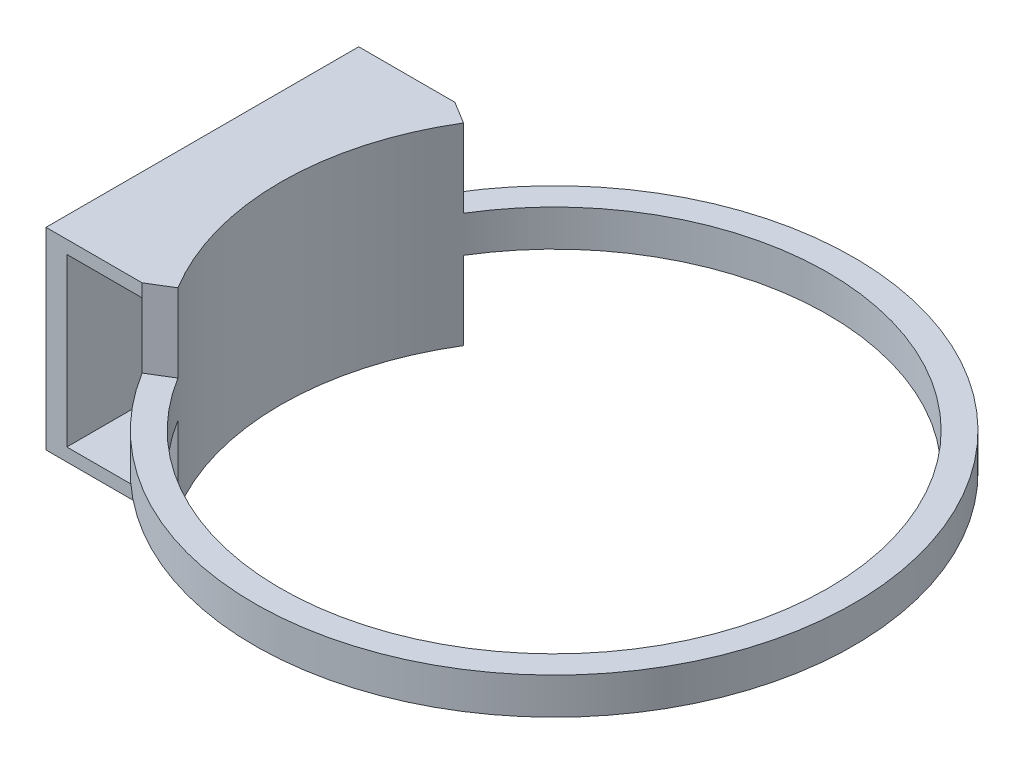
ISO-10303-21;
HEADER;
FILE_DESCRIPTION(('STEP AP214'),'2;1');
FILE_NAME('part.step','',(''),(''),'','','');
FILE_SCHEMA(('AUTOMOTIVE_DESIGN { 1 0 10303 214 1 1 1 1 }'));
ENDSEC;
DATA;
#1=APPLICATION_CONTEXT('core data for automotive mechanical design processes');
#2=APPLICATION_PROTOCOL_DEFINITION('international standard','automotive_design',2000,#1);
#3=PRODUCT_CONTEXT('',#1,'mechanical');
#4=PRODUCT('Part','Part','',(#3));
#5=PRODUCT_RELATED_PRODUCT_CATEGORY('part','',(#4));
#6=PRODUCT_DEFINITION_FORMATION('','',#4);
#7=PRODUCT_DEFINITION_CONTEXT('part definition',#1,'design');
#8=PRODUCT_DEFINITION('design','',#6,#7);
#9=PRODUCT_DEFINITION_SHAPE('','',#8);
#10=(LENGTH_UNIT() NAMED_UNIT(*) SI_UNIT(.MILLI.,.METRE.));
#11=(NAMED_UNIT(*) PLANE_ANGLE_UNIT() SI_UNIT($,.RADIAN.));
#12=(NAMED_UNIT(*) SI_UNIT($,.STERADIAN.) SOLID_ANGLE_UNIT());
#13=UNCERTAINTY_MEASURE_WITH_UNIT(LENGTH_MEASURE(1.E-05),#10,'distance_accuracy_value','');
#14=(GEOMETRIC_REPRESENTATION_CONTEXT(3) GLOBAL_UNCERTAINTY_ASSIGNED_CONTEXT((#13)) GLOBAL_UNIT_ASSIGNED_CONTEXT((#10,
#11,#12)) REPRESENTATION_CONTEXT('',''));
#15=CARTESIAN_POINT('',(0.,0.,0.));
#16=DIRECTION('',(0.,0.,1.));
#17=DIRECTION('',(1.,0.,0.));
#18=AXIS2_PLACEMENT_3D('',#15,#16,#17);
#19=CARTESIAN_POINT('',(0.,0.5,0.));
#20=DIRECTION('',(0.,-1.,0.));
#21=DIRECTION('',(0.,0.,-1.));
#22=AXIS2_PLACEMENT_3D('',#19,#20,#21);
#23=CYLINDRICAL_SURFACE('',#22,11.5);
#24=CARTESIAN_POINT('',(0.,3.,0.));
#25=DIRECTION('',(0.,-1.,0.));
#26=DIRECTION('',(0.,0.,-1.));
#27=AXIS2_PLACEMENT_3D('',#24,#25,#26);
#28=CIRCLE('',#27,11.5);
#29=CARTESIAN_POINT('',(-9.81070843517429,3.,-6.));
#30=VERTEX_POINT('',#29);
#31=CARTESIAN_POINT('',(-9.8107084351743,3.,5.99999999999999));
#32=VERTEX_POINT('',#31);
#33=EDGE_CURVE('E154',#30,#32,#28,.T.);
#34=ORIENTED_EDGE('',*,*,#33,.F.);
#35=DIRECTION('',(0.,-1.,0.));
#36=VECTOR('',#35,1.);
#37=CARTESIAN_POINT('',(-9.81070843517429,3.,-6.));
#38=LINE('',#37,#36);
#39=CARTESIAN_POINT('',(-9.81070843517429,0.5,-6.));
#40=VERTEX_POINT('',#39);
#41=EDGE_CURVE('E196',#30,#40,#38,.T.);
#42=ORIENTED_EDGE('',*,*,#41,.T.);
#43=CARTESIAN_POINT('',(0.,0.5,0.));
#44=DIRECTION('',(0.,1.,0.));
#45=DIRECTION('',(0.,0.,1.));
#46=AXIS2_PLACEMENT_3D('',#43,#44,#45);
#47=CIRCLE('',#46,11.5);
#48=CARTESIAN_POINT('',(-9.8107084351743,0.5,5.99999999999999));
#49=VERTEX_POINT('',#48);
#50=EDGE_CURVE('E11',#40,#49,#47,.T.);
#51=ORIENTED_EDGE('',*,*,#50,.T.);
#52=DIRECTION('',(0.,-1.,0.));
#53=VECTOR('',#52,1.);
#54=CARTESIAN_POINT('',(-9.8107084351743,3.,5.99999999999999));
#55=LINE('',#54,#53);
#56=EDGE_CURVE('E147',#32,#49,#55,.T.);
#57=ORIENTED_EDGE('',*,*,#56,.F.);
#58=EDGE_LOOP('',(#34,#42,#51,#57));
#59=FACE_BOUND('',#58,.T.);
#60=CARTESIAN_POINT('',(0.,4.4,0.));
#61=DIRECTION('',(0.,1.,0.));
#62=DIRECTION('',(0.,0.,1.));
#63=AXIS2_PLACEMENT_3D('',#60,#61,#62);
#64=CIRCLE('',#63,11.5);
#65=CARTESIAN_POINT('',(-9.8107084351743,4.4,6.));
#66=VERTEX_POINT('',#65);
#67=CARTESIAN_POINT('',(-9.81070843517429,4.4,-6.));
#68=VERTEX_POINT('',#67);
#69=EDGE_CURVE('E176',#66,#68,#64,.T.);
#70=ORIENTED_EDGE('',*,*,#69,.F.);
#71=DIRECTION('',(0.,1.,0.));
#72=VECTOR('',#71,1.);
#73=CARTESIAN_POINT('',(-9.8107084351743,4.4,6.));
#74=LINE('',#73,#72);
#75=CARTESIAN_POINT('',(-9.8107084351743,6.9,6.));
#76=VERTEX_POINT('',#75);
#77=EDGE_CURVE('E199',#66,#76,#74,.T.);
#78=ORIENTED_EDGE('',*,*,#77,.T.);
#79=CARTESIAN_POINT('',(1.16226472890446E-13,6.9,0.));
#80=DIRECTION('',(0.,-1.,0.));
#81=DIRECTION('',(0.,0.,-1.));
#82=AXIS2_PLACEMENT_3D('',#79,#80,#81);
#83=CIRCLE('',#82,11.5000000000001);
#84=CARTESIAN_POINT('',(-9.81070843517429,6.9,-6.));
#85=VERTEX_POINT('',#84);
#86=EDGE_CURVE('E230',#76,#85,#83,.T.);
#87=ORIENTED_EDGE('',*,*,#86,.T.);
#88=DIRECTION('',(0.,1.,0.));
#89=VECTOR('',#88,1.);
#90=CARTESIAN_POINT('',(-9.81070843517429,4.4,-6.));
#91=LINE('',#90,#89);
#92=EDGE_CURVE('E192',#68,#85,#91,.T.);
#93=ORIENTED_EDGE('',*,*,#92,.F.);
#94=EDGE_LOOP('',(#70,#78,#87,#93));
#95=FACE_BOUND('',#94,.T.);
#96=ADVANCED_FACE('F41',(#59,#95),#23,.T.);
#97=CARTESIAN_POINT('',(0.,0.5,0.));
#98=DIRECTION('',(0.,1.,0.));
#99=DIRECTION('',(0.,0.,1.));
#100=AXIS2_PLACEMENT_3D('',#97,#98,#99);
#101=PLANE('',#100);
#102=DIRECTION('',(-1.,0.,0.));
#103=VECTOR('',#102,1.);
#104=CARTESIAN_POINT('',(-13.5,0.5,-6.));
#105=LINE('',#104,#103);
#106=CARTESIAN_POINT('',(-12.7,0.5,-6.));
#107=VERTEX_POINT('',#106);
#108=EDGE_CURVE('E63',#40,#107,#105,.T.);
#109=ORIENTED_EDGE('',*,*,#108,.T.);
#110=DIRECTION('',(0.,0.,-1.));
#111=VECTOR('',#110,1.);
#112=CARTESIAN_POINT('',(-12.7,0.5,-6.));
#113=LINE('',#112,#111);
#114=CARTESIAN_POINT('',(-12.7,0.5,6.));
#115=VERTEX_POINT('',#114);
#116=EDGE_CURVE('E58',#115,#107,#113,.T.);
#117=ORIENTED_EDGE('',*,*,#116,.F.);
#118=DIRECTION('',(1.,0.,0.));
#119=VECTOR('',#118,1.);
#120=CARTESIAN_POINT('',(-13.5,0.5,6.));
#121=LINE('',#120,#119);
#122=EDGE_CURVE('E264',#115,#49,#121,.T.);
#123=ORIENTED_EDGE('',*,*,#122,.T.);
#124=ORIENTED_EDGE('',*,*,#50,.F.);
#125=EDGE_LOOP('',(#109,#117,#123,#124));
#126=FACE_BOUND('',#125,.T.);
#127=ADVANCED_FACE('F337',(#126),#101,.T.);
#128=CARTESIAN_POINT('',(-13.5,0.5,-6.));
#129=DIRECTION('',(0.,0.,1.));
#130=DIRECTION('',(1.,0.,0.));
#131=AXIS2_PLACEMENT_3D('',#128,#129,#130);
#132=PLANE('',#131);
#133=DIRECTION('',(-1.,0.,0.));
#134=VECTOR('',#133,1.);
#135=CARTESIAN_POINT('',(-13.5,0.,-6.));
#136=LINE('',#135,#134);
#137=CARTESIAN_POINT('',(-9.81070843517429,0.,-6.));
#138=VERTEX_POINT('',#137);
#139=CARTESIAN_POINT('',(-13.5,0.,-6.));
#140=VERTEX_POINT('',#139);
#141=EDGE_CURVE('E260',#138,#140,#136,.T.);
#142=ORIENTED_EDGE('',*,*,#141,.T.);
#143=DIRECTION('',(0.,-1.,0.));
#144=VECTOR('',#143,1.);
#145=CARTESIAN_POINT('',(-13.5,0.5,-6.));
#146=LINE('',#145,#144);
#147=CARTESIAN_POINT('',(-13.5,7.4,-6.));
#148=VERTEX_POINT('',#147);
#149=EDGE_CURVE('E287',#148,#140,#146,.T.);
#150=ORIENTED_EDGE('',*,*,#149,.F.);
#151=DIRECTION('',(-1.,0.,0.));
#152=VECTOR('',#151,1.);
#153=CARTESIAN_POINT('',(-13.5,7.4,-6.));
#154=LINE('',#153,#152);
#155=CARTESIAN_POINT('',(-9.81070843517429,7.4,-6.));
#156=VERTEX_POINT('',#155);
#157=EDGE_CURVE('E222',#156,#148,#154,.T.);
#158=ORIENTED_EDGE('',*,*,#157,.F.);
#159=DIRECTION('',(0.,-1.,0.));
#160=VECTOR('',#159,1.);
#161=CARTESIAN_POINT('',(-9.81070843517429,7.4,-6.));
#162=LINE('',#161,#160);
#163=EDGE_CURVE('E226',#156,#85,#162,.T.);
#164=ORIENTED_EDGE('',*,*,#163,.T.);
#165=DIRECTION('',(-1.,0.,0.));
#166=VECTOR('',#165,1.);
#167=CARTESIAN_POINT('',(-13.5,6.9,-6.));
#168=LINE('',#167,#166);
#169=CARTESIAN_POINT('',(-12.7,6.9,-6.));
#170=VERTEX_POINT('',#169);
#171=EDGE_CURVE('E218',#85,#170,#168,.T.);
#172=ORIENTED_EDGE('',*,*,#171,.T.);
#173=DIRECTION('',(0.,-1.,0.));
#174=VECTOR('',#173,1.);
#175=CARTESIAN_POINT('',(-12.7,6.9,-6.));
#176=LINE('',#175,#174);
#177=EDGE_CURVE('E247',#170,#107,#176,.T.);
#178=ORIENTED_EDGE('',*,*,#177,.T.);
#179=ORIENTED_EDGE('',*,*,#108,.F.);
#180=DIRECTION('',(0.,-1.,0.));
#181=VECTOR('',#180,1.);
#182=CARTESIAN_POINT('',(-9.81070843517429,0.5,-6.));
#183=LINE('',#182,#181);
#184=EDGE_CURVE('E45',#40,#138,#183,.T.);
#185=ORIENTED_EDGE('',*,*,#184,.T.);
#186=EDGE_LOOP('',(#142,#150,#158,#164,#172,#178,#179,#185));
#187=FACE_BOUND('',#186,.T.);
#188=ADVANCED_FACE('F43',(#187),#132,.F.);
#189=CARTESIAN_POINT('',(-13.5,0.5,0.));
#190=DIRECTION('',(1.,0.,0.));
#191=DIRECTION('',(0.,0.,-1.));
#192=AXIS2_PLACEMENT_3D('',#189,#190,#191);
#193=PLANE('',#192);
#194=DIRECTION('',(0.,0.,1.));
#195=VECTOR('',#194,1.);
#196=CARTESIAN_POINT('',(-13.5,0.,0.));
#197=LINE('',#196,#195);
#198=CARTESIAN_POINT('',(-13.5,0.,6.));
#199=VERTEX_POINT('',#198);
#200=EDGE_CURVE('E272',#140,#199,#197,.T.);
#201=ORIENTED_EDGE('',*,*,#200,.T.);
#202=DIRECTION('',(0.,-1.,0.));
#203=VECTOR('',#202,1.);
#204=CARTESIAN_POINT('',(-13.5,0.5,6.));
#205=LINE('',#204,#203);
#206=CARTESIAN_POINT('',(-13.5,7.4,6.));
#207=VERTEX_POINT('',#206);
#208=EDGE_CURVE('E284',#207,#199,#205,.T.);
#209=ORIENTED_EDGE('',*,*,#208,.F.);
#210=DIRECTION('',(0.,0.,1.));
#211=VECTOR('',#210,1.);
#212=CARTESIAN_POINT('',(-13.5,7.4,-6.));
#213=LINE('',#212,#211);
#214=EDGE_CURVE('E213',#148,#207,#213,.T.);
#215=ORIENTED_EDGE('',*,*,#214,.F.);
#216=ORIENTED_EDGE('',*,*,#149,.T.);
#217=EDGE_LOOP('',(#201,#209,#215,#216));
#218=FACE_BOUND('',#217,.T.);
#219=ADVANCED_FACE('F303',(#218),#193,.F.);
#220=CARTESIAN_POINT('',(-13.5,0.5,6.));
#221=DIRECTION('',(0.,0.,-1.));
#222=DIRECTION('',(-1.,0.,0.));
#223=AXIS2_PLACEMENT_3D('',#220,#221,#222);
#224=PLANE('',#223);
#225=DIRECTION('',(1.,0.,0.));
#226=VECTOR('',#225,1.);
#227=CARTESIAN_POINT('',(-13.5,0.,6.));
#228=LINE('',#227,#226);
#229=CARTESIAN_POINT('',(-9.8107084351743,0.,5.99999999999999));
#230=VERTEX_POINT('',#229);
#231=EDGE_CURVE('E275',#199,#230,#228,.T.);
#232=ORIENTED_EDGE('',*,*,#231,.T.);
#233=DIRECTION('',(0.,-1.,0.));
#234=VECTOR('',#233,1.);
#235=CARTESIAN_POINT('',(-9.8107084351743,0.5,5.99999999999999));
#236=LINE('',#235,#234);
#237=EDGE_CURVE('E268',#49,#230,#236,.T.);
#238=ORIENTED_EDGE('',*,*,#237,.F.);
#239=ORIENTED_EDGE('',*,*,#122,.F.);
#240=DIRECTION('',(0.,-1.,0.));
#241=VECTOR('',#240,1.);
#242=CARTESIAN_POINT('',(-12.7,6.9,6.));
#243=LINE('',#242,#241);
#244=CARTESIAN_POINT('',(-12.7,6.9,6.));
#245=VERTEX_POINT('',#244);
#246=EDGE_CURVE('E253',#245,#115,#243,.T.);
#247=ORIENTED_EDGE('',*,*,#246,.F.);
#248=DIRECTION('',(1.,0.,0.));
#249=VECTOR('',#248,1.);
#250=CARTESIAN_POINT('',(-13.5,6.9,6.));
#251=LINE('',#250,#249);
#252=EDGE_CURVE('E203',#245,#76,#251,.T.);
#253=ORIENTED_EDGE('',*,*,#252,.T.);
#254=DIRECTION('',(0.,-1.,0.));
#255=VECTOR('',#254,1.);
#256=CARTESIAN_POINT('',(-9.8107084351743,7.4,6.));
#257=LINE('',#256,#255);
#258=CARTESIAN_POINT('',(-9.8107084351743,7.4,6.));
#259=VERTEX_POINT('',#258);
#260=EDGE_CURVE('E240',#259,#76,#257,.T.);
#261=ORIENTED_EDGE('',*,*,#260,.F.);
#262=DIRECTION('',(1.,0.,0.));
#263=VECTOR('',#262,1.);
#264=CARTESIAN_POINT('',(-13.5,7.4,6.));
#265=LINE('',#264,#263);
#266=EDGE_CURVE('E217',#207,#259,#265,.T.);
#267=ORIENTED_EDGE('',*,*,#266,.F.);
#268=ORIENTED_EDGE('',*,*,#208,.T.);
#269=EDGE_LOOP('',(#232,#238,#239,#247,#253,#261,#267,#268));
#270=FACE_BOUND('',#269,.T.);
#271=ADVANCED_FACE('F306',(#270),#224,.F.);
#272=CARTESIAN_POINT('',(0.,0.5,0.));
#273=DIRECTION('',(0.,-1.,0.));
#274=DIRECTION('',(0.,0.,-1.));
#275=AXIS2_PLACEMENT_3D('',#272,#273,#274);
#276=CYLINDRICAL_SURFACE('',#275,10.5);
#277=CARTESIAN_POINT('',(0.,0.,0.));
#278=DIRECTION('',(0.,-1.,0.));
#279=DIRECTION('',(0.,0.,1.));
#280=AXIS2_PLACEMENT_3D('',#277,#278,#279);
#281=CIRCLE('',#280,10.5);
#282=CARTESIAN_POINT('',(-8.95760335385479,0.,5.47826086956521));
#283=VERTEX_POINT('',#282);
#284=CARTESIAN_POINT('',(-8.95760335385479,0.,-5.47826086956522));
#285=VERTEX_POINT('',#284);
#286=EDGE_CURVE('E265',#283,#285,#281,.T.);
#287=ORIENTED_EDGE('',*,*,#286,.T.);
#288=DIRECTION('',(0.,-1.,0.));
#289=VECTOR('',#288,1.);
#290=CARTESIAN_POINT('',(-8.95760335385479,3.,-5.47826086956522));
#291=LINE('',#290,#289);
#292=CARTESIAN_POINT('',(-8.95760335385479,3.,-5.47826086956522));
#293=VERTEX_POINT('',#292);
#294=EDGE_CURVE('E171',#293,#285,#291,.T.);
#295=ORIENTED_EDGE('',*,*,#294,.F.);
#296=CARTESIAN_POINT('',(0.,3.,0.));
#297=DIRECTION('',(0.,1.,0.));
#298=DIRECTION('',(0.,0.,-1.));
#299=AXIS2_PLACEMENT_3D('',#296,#297,#298);
#300=CIRCLE('',#299,10.5);
#301=CARTESIAN_POINT('',(-8.95760335385479,3.,5.47826086956521));
#302=VERTEX_POINT('',#301);
#303=EDGE_CURVE('E153',#302,#293,#300,.T.);
#304=ORIENTED_EDGE('',*,*,#303,.F.);
#305=DIRECTION('',(0.,-1.,0.));
#306=VECTOR('',#305,1.);
#307=CARTESIAN_POINT('',(-8.95760335385479,3.,5.47826086956521));
#308=LINE('',#307,#306);
#309=EDGE_CURVE('E149',#302,#283,#308,.T.);
#310=ORIENTED_EDGE('',*,*,#309,.T.);
#311=EDGE_LOOP('',(#287,#295,#304,#310));
#312=FACE_BOUND('',#311,.T.);
#313=CARTESIAN_POINT('',(0.,7.4,0.));
#314=DIRECTION('',(0.,-1.,0.));
#315=DIRECTION('',(0.,0.,1.));
#316=AXIS2_PLACEMENT_3D('',#313,#314,#315);
#317=CIRCLE('',#316,10.5);
#318=CARTESIAN_POINT('',(-8.9576033538548,7.4,5.47826086956521));
#319=VERTEX_POINT('',#318);
#320=CARTESIAN_POINT('',(-8.9576033538548,7.4,-5.47826086956522));
#321=VERTEX_POINT('',#320);
#322=EDGE_CURVE('E257',#319,#321,#317,.T.);
#323=ORIENTED_EDGE('',*,*,#322,.F.);
#324=DIRECTION('',(0.,1.,0.));
#325=VECTOR('',#324,1.);
#326=CARTESIAN_POINT('',(-8.9576033538548,4.4,5.47826086956521));
#327=LINE('',#326,#325);
#328=CARTESIAN_POINT('',(-8.9576033538548,4.4,5.47826086956521));
#329=VERTEX_POINT('',#328);
#330=EDGE_CURVE('E204',#329,#319,#327,.T.);
#331=ORIENTED_EDGE('',*,*,#330,.F.);
#332=CARTESIAN_POINT('',(0.,4.4,0.));
#333=DIRECTION('',(0.,-1.,0.));
#334=DIRECTION('',(0.,0.,1.));
#335=AXIS2_PLACEMENT_3D('',#332,#333,#334);
#336=CIRCLE('',#335,10.5);
#337=CARTESIAN_POINT('',(-8.9576033538548,4.4,-5.47826086956522));
#338=VERTEX_POINT('',#337);
#339=EDGE_CURVE('E185',#338,#329,#336,.T.);
#340=ORIENTED_EDGE('',*,*,#339,.F.);
#341=DIRECTION('',(0.,1.,0.));
#342=VECTOR('',#341,1.);
#343=CARTESIAN_POINT('',(-8.9576033538548,4.4,-5.47826086956522));
#344=LINE('',#343,#342);
#345=EDGE_CURVE('E207',#338,#321,#344,.T.);
#346=ORIENTED_EDGE('',*,*,#345,.T.);
#347=EDGE_LOOP('',(#323,#331,#340,#346));
#348=FACE_BOUND('',#347,.T.);
#349=ADVANCED_FACE('F345',(#312,#348),#276,.F.);
#350=CARTESIAN_POINT('',(0.,0.,0.));
#351=DIRECTION('',(0.,1.,0.));
#352=DIRECTION('',(0.,0.,1.));
#353=AXIS2_PLACEMENT_3D('',#350,#351,#352);
#354=PLANE('',#353);
#355=ORIENTED_EDGE('',*,*,#141,.F.);
#356=DIRECTION('',(-0.853105081319504,0.,-0.521739130434782));
#357=VECTOR('',#356,1.);
#358=CARTESIAN_POINT('',(-9.81070843517429,0.,-6.));
#359=LINE('',#358,#357);
#360=EDGE_CURVE('E164',#285,#138,#359,.T.);
#361=ORIENTED_EDGE('',*,*,#360,.F.);
#362=ORIENTED_EDGE('',*,*,#286,.F.);
#363=DIRECTION('',(0.853105081319504,0.,-0.521739130434782));
#364=VECTOR('',#363,1.);
#365=CARTESIAN_POINT('',(-9.8107084351743,0.,5.99999999999999));
#366=LINE('',#365,#364);
#367=EDGE_CURVE('E479',#230,#283,#366,.T.);
#368=ORIENTED_EDGE('',*,*,#367,.F.);
#369=ORIENTED_EDGE('',*,*,#231,.F.);
#370=ORIENTED_EDGE('',*,*,#200,.F.);
#371=EDGE_LOOP('',(#355,#361,#362,#368,#369,#370));
#372=FACE_BOUND('',#371,.T.);
#373=ADVANCED_FACE('F299',(#372),#354,.F.);
#374=CARTESIAN_POINT('',(0.,7.4,0.));
#375=DIRECTION('',(0.,1.,0.));
#376=DIRECTION('',(0.,0.,1.));
#377=AXIS2_PLACEMENT_3D('',#374,#375,#376);
#378=PLANE('',#377);
#379=DIRECTION('',(-0.853105081319504,0.,0.521739130434782));
#380=VECTOR('',#379,1.);
#381=CARTESIAN_POINT('',(-9.8107084351743,7.4,6.));
#382=LINE('',#381,#380);
#383=EDGE_CURVE('E181',#319,#259,#382,.T.);
#384=ORIENTED_EDGE('',*,*,#383,.F.);
#385=ORIENTED_EDGE('',*,*,#322,.T.);
#386=DIRECTION('',(0.853105081319503,0.,0.521739130434783));
#387=VECTOR('',#386,1.);
#388=CARTESIAN_POINT('',(-9.81070843517429,7.4,-6.));
#389=LINE('',#388,#387);
#390=EDGE_CURVE('E193',#156,#321,#389,.T.);
#391=ORIENTED_EDGE('',*,*,#390,.F.);
#392=ORIENTED_EDGE('',*,*,#157,.T.);
#393=ORIENTED_EDGE('',*,*,#214,.T.);
#394=ORIENTED_EDGE('',*,*,#266,.T.);
#395=EDGE_LOOP('',(#384,#385,#391,#392,#393,#394));
#396=FACE_BOUND('',#395,.T.);
#397=ADVANCED_FACE('F311',(#396),#378,.T.);
#398=CARTESIAN_POINT('',(-12.7,6.9,-6.));
#399=DIRECTION('',(-1.,0.,0.));
#400=DIRECTION('',(0.,0.,1.));
#401=AXIS2_PLACEMENT_3D('',#398,#399,#400);
#402=PLANE('',#401);
#403=ORIENTED_EDGE('',*,*,#116,.T.);
#404=ORIENTED_EDGE('',*,*,#177,.F.);
#405=DIRECTION('',(0.,0.,-1.));
#406=VECTOR('',#405,1.);
#407=CARTESIAN_POINT('',(-12.7,6.9,-6.));
#408=LINE('',#407,#406);
#409=EDGE_CURVE('E243',#245,#170,#408,.T.);
#410=ORIENTED_EDGE('',*,*,#409,.F.);
#411=ORIENTED_EDGE('',*,*,#246,.T.);
#412=EDGE_LOOP('',(#403,#404,#410,#411));
#413=FACE_BOUND('',#412,.T.);
#414=ADVANCED_FACE('F326',(#413),#402,.F.);
#415=CARTESIAN_POINT('',(1.16226472890446E-13,6.9,0.));
#416=DIRECTION('',(0.,-1.,0.));
#417=DIRECTION('',(0.,0.,-1.));
#418=AXIS2_PLACEMENT_3D('',#415,#416,#417);
#419=PLANE('',#418);
#420=ORIENTED_EDGE('',*,*,#252,.F.);
#421=ORIENTED_EDGE('',*,*,#409,.T.);
#422=ORIENTED_EDGE('',*,*,#171,.F.);
#423=ORIENTED_EDGE('',*,*,#86,.F.);
#424=EDGE_LOOP('',(#420,#421,#422,#423));
#425=FACE_BOUND('',#424,.T.);
#426=ADVANCED_FACE('F319',(#425),#419,.T.);
#427=CARTESIAN_POINT('',(-9.8107084351743,4.4,6.));
#428=DIRECTION('',(-0.521739130434782,0.,-0.853105081319504));
#429=DIRECTION('',(-0.853105081319504,0.,0.521739130434782));
#430=AXIS2_PLACEMENT_3D('',#427,#428,#429);
#431=PLANE('',#430);
#432=ORIENTED_EDGE('',*,*,#383,.T.);
#433=ORIENTED_EDGE('',*,*,#260,.T.);
#434=ORIENTED_EDGE('',*,*,#77,.F.);
#435=DIRECTION('',(-0.853105081319504,0.,0.521739130434782));
#436=VECTOR('',#435,1.);
#437=CARTESIAN_POINT('',(-9.8107084351743,4.4,6.));
#438=LINE('',#437,#436);
#439=EDGE_CURVE('E188',#329,#66,#438,.T.);
#440=ORIENTED_EDGE('',*,*,#439,.F.);
#441=ORIENTED_EDGE('',*,*,#330,.T.);
#442=EDGE_LOOP('',(#432,#433,#434,#440,#441));
#443=FACE_BOUND('',#442,.T.);
#444=ADVANCED_FACE('F333',(#443),#431,.F.);
#445=CARTESIAN_POINT('',(-9.81070843517429,4.4,-6.));
#446=DIRECTION('',(-0.521739130434783,0.,0.853105081319503));
#447=DIRECTION('',(0.853105081319503,0.,0.521739130434783));
#448=AXIS2_PLACEMENT_3D('',#445,#446,#447);
#449=PLANE('',#448);
#450=ORIENTED_EDGE('',*,*,#390,.T.);
#451=ORIENTED_EDGE('',*,*,#345,.F.);
#452=DIRECTION('',(0.853105081319503,0.,0.521739130434783));
#453=VECTOR('',#452,1.);
#454=CARTESIAN_POINT('',(-9.81070843517429,4.4,-6.));
#455=LINE('',#454,#453);
#456=EDGE_CURVE('E180',#68,#338,#455,.T.);
#457=ORIENTED_EDGE('',*,*,#456,.F.);
#458=ORIENTED_EDGE('',*,*,#92,.T.);
#459=ORIENTED_EDGE('',*,*,#163,.F.);
#460=EDGE_LOOP('',(#450,#451,#457,#458,#459));
#461=FACE_BOUND('',#460,.T.);
#462=ADVANCED_FACE('F377',(#461),#449,.F.);
#463=CARTESIAN_POINT('',(0.,4.4,0.));
#464=DIRECTION('',(0.,1.,0.));
#465=DIRECTION('',(0.,0.,1.));
#466=AXIS2_PLACEMENT_3D('',#463,#464,#465);
#467=PLANE('',#466);
#468=ORIENTED_EDGE('',*,*,#69,.T.);
#469=ORIENTED_EDGE('',*,*,#456,.T.);
#470=ORIENTED_EDGE('',*,*,#339,.T.);
#471=ORIENTED_EDGE('',*,*,#439,.T.);
#472=EDGE_LOOP('',(#468,#469,#470,#471));
#473=FACE_BOUND('',#472,.T.);
#474=ADVANCED_FACE('F371',(#473),#467,.T.);
#475=CARTESIAN_POINT('',(-9.81070843517429,3.,-6.));
#476=DIRECTION('',(-0.521739130434782,0.,0.853105081319504));
#477=DIRECTION('',(0.853105081319504,0.,0.521739130434782));
#478=AXIS2_PLACEMENT_3D('',#475,#476,#477);
#479=PLANE('',#478);
#480=ORIENTED_EDGE('',*,*,#360,.T.);
#481=ORIENTED_EDGE('',*,*,#184,.F.);
#482=ORIENTED_EDGE('',*,*,#41,.F.);
#483=DIRECTION('',(-0.853105081319504,0.,-0.521739130434782));
#484=VECTOR('',#483,1.);
#485=CARTESIAN_POINT('',(-9.81070843517429,3.,-6.));
#486=LINE('',#485,#484);
#487=EDGE_CURVE('E160',#293,#30,#486,.T.);
#488=ORIENTED_EDGE('',*,*,#487,.F.);
#489=ORIENTED_EDGE('',*,*,#294,.T.);
#490=EDGE_LOOP('',(#480,#481,#482,#488,#489));
#491=FACE_BOUND('',#490,.T.);
#492=ADVANCED_FACE('F376',(#491),#479,.F.);
#493=CARTESIAN_POINT('',(-9.8107084351743,3.,5.99999999999999));
#494=DIRECTION('',(-0.521739130434782,0.,-0.853105081319504));
#495=DIRECTION('',(-0.853105081319504,0.,0.521739130434782));
#496=AXIS2_PLACEMENT_3D('',#493,#494,#495);
#497=PLANE('',#496);
#498=ORIENTED_EDGE('',*,*,#367,.T.);
#499=ORIENTED_EDGE('',*,*,#309,.F.);
#500=DIRECTION('',(0.853105081319504,0.,-0.521739130434782));
#501=VECTOR('',#500,1.);
#502=CARTESIAN_POINT('',(-9.8107084351743,3.,5.99999999999999));
#503=LINE('',#502,#501);
#504=EDGE_CURVE('E143',#32,#302,#503,.T.);
#505=ORIENTED_EDGE('',*,*,#504,.F.);
#506=ORIENTED_EDGE('',*,*,#56,.T.);
#507=ORIENTED_EDGE('',*,*,#237,.T.);
#508=EDGE_LOOP('',(#498,#499,#505,#506,#507));
#509=FACE_BOUND('',#508,.T.);
#510=ADVANCED_FACE('F145',(#509),#497,.F.);
#511=CARTESIAN_POINT('',(0.,3.,0.));
#512=DIRECTION('',(0.,-1.,0.));
#513=DIRECTION('',(0.,0.,-1.));
#514=AXIS2_PLACEMENT_3D('',#511,#512,#513);
#515=PLANE('',#514);
#516=ORIENTED_EDGE('',*,*,#33,.T.);
#517=ORIENTED_EDGE('',*,*,#504,.T.);
#518=ORIENTED_EDGE('',*,*,#303,.T.);
#519=ORIENTED_EDGE('',*,*,#487,.T.);
#520=EDGE_LOOP('',(#516,#517,#518,#519));
#521=FACE_BOUND('',#520,.T.);
#522=ADVANCED_FACE('F158',(#521),#515,.T.);
#523=CLOSED_SHELL('',(#96,#127,#188,#219,#271,#349,#373,#397,#414,#426,#444,#462,#474,#492,#510,#522));
#524=MANIFOLD_SOLID_BREP('B2',#523);
#525=ADVANCED_BREP_SHAPE_REPRESENTATION('',(#18,#524),#14);
#526=SHAPE_DEFINITION_REPRESENTATION(#9,#525);
ENDSEC;
END-ISO-10303-21;
